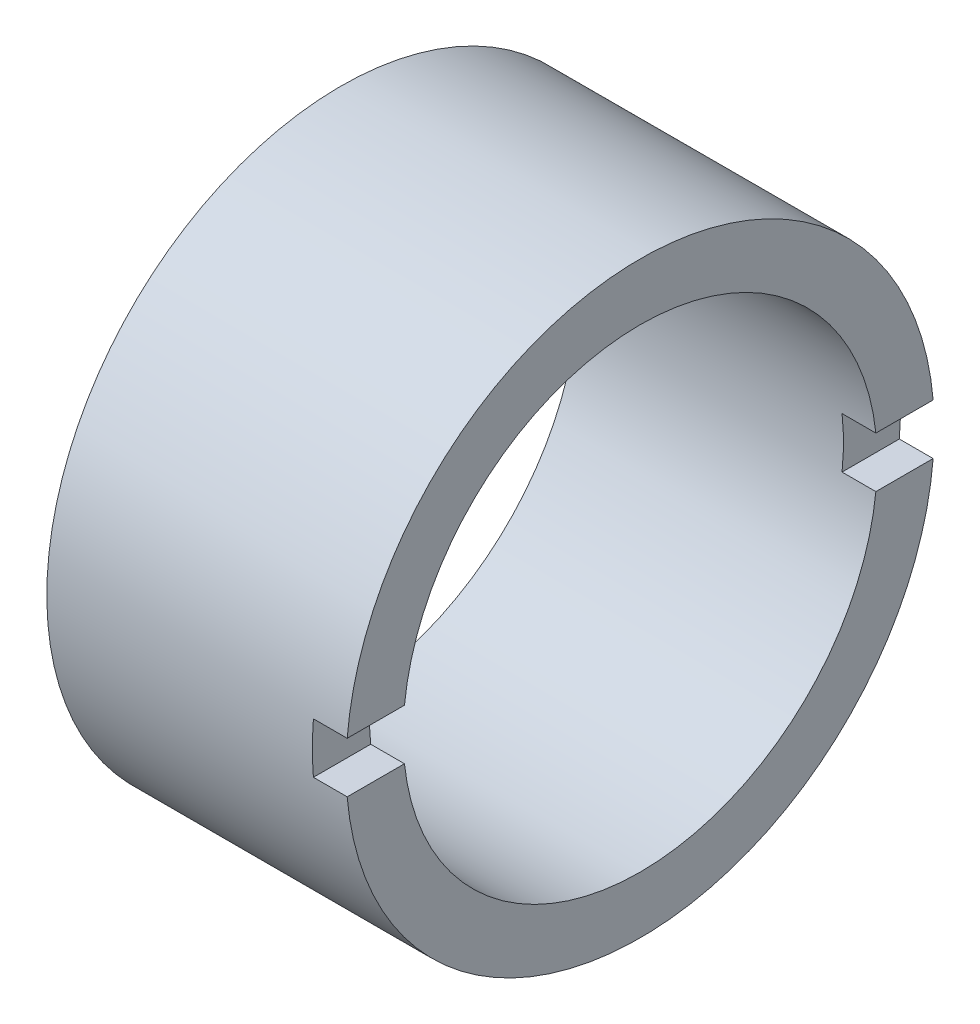
ISO-10303-21;
HEADER;
FILE_DESCRIPTION(('STEP AP214'),'2;1');
FILE_NAME('part.step','',(''),(''),'','','');
FILE_SCHEMA(('AUTOMOTIVE_DESIGN { 1 0 10303 214 1 1 1 1 }'));
ENDSEC;
DATA;
#1=APPLICATION_CONTEXT('core data for automotive mechanical design processes');
#2=APPLICATION_PROTOCOL_DEFINITION('international standard','automotive_design',2000,#1);
#3=PRODUCT_CONTEXT('',#1,'mechanical');
#4=PRODUCT('Part','Part','',(#3));
#5=PRODUCT_RELATED_PRODUCT_CATEGORY('part','',(#4));
#6=PRODUCT_DEFINITION_FORMATION('','',#4);
#7=PRODUCT_DEFINITION_CONTEXT('part definition',#1,'design');
#8=PRODUCT_DEFINITION('design','',#6,#7);
#9=PRODUCT_DEFINITION_SHAPE('','',#8);
#10=(LENGTH_UNIT() NAMED_UNIT(*) SI_UNIT(.MILLI.,.METRE.));
#11=(NAMED_UNIT(*) PLANE_ANGLE_UNIT() SI_UNIT($,.RADIAN.));
#12=(NAMED_UNIT(*) SI_UNIT($,.STERADIAN.) SOLID_ANGLE_UNIT());
#13=UNCERTAINTY_MEASURE_WITH_UNIT(LENGTH_MEASURE(1.E-05),#10,'distance_accuracy_value','');
#14=(GEOMETRIC_REPRESENTATION_CONTEXT(3) GLOBAL_UNCERTAINTY_ASSIGNED_CONTEXT((#13)) GLOBAL_UNIT_ASSIGNED_CONTEXT((#10,
#11,#12)) REPRESENTATION_CONTEXT('',''));
#15=CARTESIAN_POINT('',(0.,0.,0.));
#16=DIRECTION('',(0.,0.,1.));
#17=DIRECTION('',(1.,0.,0.));
#18=AXIS2_PLACEMENT_3D('',#15,#16,#17);
#19=CARTESIAN_POINT('',(27.0002,0.,0.));
#20=DIRECTION('',(1.,0.,0.));
#21=DIRECTION('',(0.,0.,-1.));
#22=AXIS2_PLACEMENT_3D('',#19,#20,#21);
#23=PLANE('',#22);
#24=DIRECTION('',(0.,0.,1.));
#25=VECTOR('',#24,1.);
#26=CARTESIAN_POINT('',(27.0002,2.28600000000001,-26.5303));
#27=LINE('',#26,#25);
#28=CARTESIAN_POINT('',(27.0002,2.28600000000001,-26.4316291985568));
#29=VERTEX_POINT('',#28);
#30=CARTESIAN_POINT('',(27.0002,2.28600000000001,-21.2642756340299));
#31=VERTEX_POINT('',#30);
#32=EDGE_CURVE('E157',#29,#31,#27,.T.);
#33=ORIENTED_EDGE('',*,*,#32,.F.);
#34=CARTESIAN_POINT('',(27.0002,0.,0.));
#35=DIRECTION('',(1.,0.,0.));
#36=DIRECTION('',(0.,0.,-1.));
#37=AXIS2_PLACEMENT_3D('',#34,#35,#36);
#38=CIRCLE('',#37,26.5303);
#39=CARTESIAN_POINT('',(27.0002,2.28600000000001,26.4316291985568));
#40=VERTEX_POINT('',#39);
#41=EDGE_CURVE('E124',#29,#40,#38,.T.);
#42=ORIENTED_EDGE('',*,*,#41,.T.);
#43=CARTESIAN_POINT('',(27.0002,2.28600000000001,21.2642756340299));
#44=VERTEX_POINT('',#43);
#45=EDGE_CURVE('E111',#44,#40,#27,.T.);
#46=ORIENTED_EDGE('',*,*,#45,.F.);
#47=CARTESIAN_POINT('',(27.0002,0.,0.));
#48=DIRECTION('',(1.,0.,0.));
#49=DIRECTION('',(0.,0.,-1.));
#50=AXIS2_PLACEMENT_3D('',#47,#48,#49);
#51=CIRCLE('',#50,21.3868);
#52=EDGE_CURVE('E129',#31,#44,#51,.T.);
#53=ORIENTED_EDGE('',*,*,#52,.F.);
#54=EDGE_LOOP('',(#33,#42,#46,#53));
#55=FACE_BOUND('',#54,.T.);
#56=ADVANCED_FACE('F38',(#55),#23,.T.);
#57=DIRECTION('',(0.,0.,1.));
#58=VECTOR('',#57,1.);
#59=CARTESIAN_POINT('',(27.0002,-2.28599999999999,-26.5303));
#60=LINE('',#59,#58);
#61=CARTESIAN_POINT('',(27.0002,-2.28599999999999,21.26427563403));
#62=VERTEX_POINT('',#61);
#63=CARTESIAN_POINT('',(27.0002,-2.28599999999999,26.4316291985568));
#64=VERTEX_POINT('',#63);
#65=EDGE_CURVE('E61',#62,#64,#60,.T.);
#66=ORIENTED_EDGE('',*,*,#65,.T.);
#67=CARTESIAN_POINT('',(27.0002,-2.28599999999999,-26.4316291985568));
#68=VERTEX_POINT('',#67);
#69=EDGE_CURVE('E118',#64,#68,#38,.T.);
#70=ORIENTED_EDGE('',*,*,#69,.T.);
#71=CARTESIAN_POINT('',(27.0002,-2.28599999999999,-21.26427563403));
#72=VERTEX_POINT('',#71);
#73=EDGE_CURVE('E101',#68,#72,#60,.T.);
#74=ORIENTED_EDGE('',*,*,#73,.T.);
#75=EDGE_CURVE('E167',#62,#72,#51,.T.);
#76=ORIENTED_EDGE('',*,*,#75,.F.);
#77=EDGE_LOOP('',(#66,#70,#74,#76));
#78=FACE_BOUND('',#77,.T.);
#79=ADVANCED_FACE('F123',(#78),#23,.T.);
#80=CARTESIAN_POINT('',(0.,0.,0.));
#81=DIRECTION('',(1.,0.,0.));
#82=DIRECTION('',(0.,0.,-1.));
#83=AXIS2_PLACEMENT_3D('',#80,#81,#82);
#84=PLANE('',#83);
#85=CARTESIAN_POINT('',(0.,0.,0.));
#86=DIRECTION('',(1.,0.,0.));
#87=DIRECTION('',(0.,0.,-1.));
#88=AXIS2_PLACEMENT_3D('',#85,#86,#87);
#89=CIRCLE('',#88,26.5303);
#90=CARTESIAN_POINT('',(0.,0.,-26.5303));
#91=VERTEX_POINT('',#90);
#92=EDGE_CURVE('E125',#91,#91,#89,.T.);
#93=ORIENTED_EDGE('',*,*,#92,.F.);
#94=EDGE_LOOP('',(#93));
#95=FACE_BOUND('',#94,.T.);
#96=CARTESIAN_POINT('',(0.,0.,0.));
#97=DIRECTION('',(1.,0.,0.));
#98=DIRECTION('',(0.,0.,-1.));
#99=AXIS2_PLACEMENT_3D('',#96,#97,#98);
#100=CIRCLE('',#99,21.3868);
#101=CARTESIAN_POINT('',(0.,0.,-21.3868));
#102=VERTEX_POINT('',#101);
#103=EDGE_CURVE('E132',#102,#102,#100,.T.);
#104=ORIENTED_EDGE('',*,*,#103,.T.);
#105=EDGE_LOOP('',(#104));
#106=FACE_BOUND('',#105,.T.);
#107=ADVANCED_FACE('F195',(#95,#106),#84,.F.);
#108=CARTESIAN_POINT('',(27.0002,0.,0.));
#109=DIRECTION('',(-1.,0.,0.));
#110=DIRECTION('',(0.,0.,1.));
#111=AXIS2_PLACEMENT_3D('',#108,#109,#110);
#112=CYLINDRICAL_SURFACE('',#111,26.5303);
#113=DIRECTION('',(-1.,0.,0.));
#114=VECTOR('',#113,1.);
#115=CARTESIAN_POINT('',(27.0002,2.28600000000001,-26.4316291985568));
#116=LINE('',#115,#114);
#117=CARTESIAN_POINT('',(23.9522,2.28600000000001,-26.4316291985568));
#118=VERTEX_POINT('',#117);
#119=EDGE_CURVE('E171',#29,#118,#116,.T.);
#120=ORIENTED_EDGE('',*,*,#119,.T.);
#121=CARTESIAN_POINT('',(23.9522,0.,0.));
#122=DIRECTION('',(-1.,0.,0.));
#123=DIRECTION('',(0.,0.,1.));
#124=AXIS2_PLACEMENT_3D('',#121,#122,#123);
#125=CIRCLE('',#124,26.5303);
#126=CARTESIAN_POINT('',(23.9522,-2.28599999999999,-26.4316291985568));
#127=VERTEX_POINT('',#126);
#128=EDGE_CURVE('E119',#118,#127,#125,.T.);
#129=ORIENTED_EDGE('',*,*,#128,.T.);
#130=DIRECTION('',(-1.,0.,0.));
#131=VECTOR('',#130,1.);
#132=CARTESIAN_POINT('',(27.0002,-2.28599999999999,-26.4316291985568));
#133=LINE('',#132,#131);
#134=EDGE_CURVE('E104',#127,#68,#133,.F.);
#135=ORIENTED_EDGE('',*,*,#134,.T.);
#136=ORIENTED_EDGE('',*,*,#69,.F.);
#137=DIRECTION('',(-1.,0.,0.));
#138=VECTOR('',#137,1.);
#139=CARTESIAN_POINT('',(27.0002,-2.28599999999999,26.4316291985568));
#140=LINE('',#139,#138);
#141=CARTESIAN_POINT('',(23.9522,-2.28599999999999,26.4316291985568));
#142=VERTEX_POINT('',#141);
#143=EDGE_CURVE('E120',#64,#142,#140,.T.);
#144=ORIENTED_EDGE('',*,*,#143,.T.);
#145=CARTESIAN_POINT('',(23.9522,2.28600000000001,26.4316291985568));
#146=VERTEX_POINT('',#145);
#147=EDGE_CURVE('E169',#142,#146,#125,.T.);
#148=ORIENTED_EDGE('',*,*,#147,.T.);
#149=DIRECTION('',(-1.,0.,0.));
#150=VECTOR('',#149,1.);
#151=CARTESIAN_POINT('',(27.0002,2.28600000000001,26.4316291985568));
#152=LINE('',#151,#150);
#153=EDGE_CURVE('E156',#146,#40,#152,.F.);
#154=ORIENTED_EDGE('',*,*,#153,.T.);
#155=ORIENTED_EDGE('',*,*,#41,.F.);
#156=EDGE_LOOP('',(#120,#129,#135,#136,#144,#148,#154,#155));
#157=FACE_BOUND('',#156,.T.);
#158=ORIENTED_EDGE('',*,*,#92,.T.);
#159=EDGE_LOOP('',(#158));
#160=FACE_BOUND('',#159,.T.);
#161=ADVANCED_FACE('F40',(#157,#160),#112,.T.);
#162=CARTESIAN_POINT('',(27.0002,0.,0.));
#163=DIRECTION('',(-1.,0.,0.));
#164=DIRECTION('',(0.,0.,1.));
#165=AXIS2_PLACEMENT_3D('',#162,#163,#164);
#166=CYLINDRICAL_SURFACE('',#165,21.3868);
#167=DIRECTION('',(-1.,0.,0.));
#168=VECTOR('',#167,1.);
#169=CARTESIAN_POINT('',(27.0002,2.28600000000001,21.2642756340299));
#170=LINE('',#169,#168);
#171=CARTESIAN_POINT('',(23.9522,2.28600000000001,21.2642756340299));
#172=VERTEX_POINT('',#171);
#173=EDGE_CURVE('E11',#172,#44,#170,.F.);
#174=ORIENTED_EDGE('',*,*,#173,.F.);
#175=CARTESIAN_POINT('',(23.9522,0.,0.));
#176=DIRECTION('',(-1.,0.,0.));
#177=DIRECTION('',(0.,0.,1.));
#178=AXIS2_PLACEMENT_3D('',#175,#176,#177);
#179=CIRCLE('',#178,21.3868);
#180=CARTESIAN_POINT('',(23.9522,-2.28599999999999,21.26427563403));
#181=VERTEX_POINT('',#180);
#182=EDGE_CURVE('E46',#181,#172,#179,.T.);
#183=ORIENTED_EDGE('',*,*,#182,.F.);
#184=DIRECTION('',(-1.,0.,0.));
#185=VECTOR('',#184,1.);
#186=CARTESIAN_POINT('',(27.0002,-2.28599999999999,21.26427563403));
#187=LINE('',#186,#185);
#188=EDGE_CURVE('E139',#62,#181,#187,.T.);
#189=ORIENTED_EDGE('',*,*,#188,.F.);
#190=ORIENTED_EDGE('',*,*,#75,.T.);
#191=DIRECTION('',(-1.,0.,0.));
#192=VECTOR('',#191,1.);
#193=CARTESIAN_POINT('',(27.0002,-2.28599999999999,-21.26427563403));
#194=LINE('',#193,#192);
#195=CARTESIAN_POINT('',(23.9522,-2.28599999999999,-21.26427563403));
#196=VERTEX_POINT('',#195);
#197=EDGE_CURVE('E106',#196,#72,#194,.F.);
#198=ORIENTED_EDGE('',*,*,#197,.F.);
#199=CARTESIAN_POINT('',(23.9522,2.28600000000001,-21.2642756340299));
#200=VERTEX_POINT('',#199);
#201=EDGE_CURVE('E136',#200,#196,#179,.T.);
#202=ORIENTED_EDGE('',*,*,#201,.F.);
#203=DIRECTION('',(-1.,0.,0.));
#204=VECTOR('',#203,1.);
#205=CARTESIAN_POINT('',(27.0002,2.28600000000001,-21.2642756340299));
#206=LINE('',#205,#204);
#207=EDGE_CURVE('E138',#31,#200,#206,.T.);
#208=ORIENTED_EDGE('',*,*,#207,.F.);
#209=ORIENTED_EDGE('',*,*,#52,.T.);
#210=EDGE_LOOP('',(#174,#183,#189,#190,#198,#202,#208,#209));
#211=FACE_BOUND('',#210,.T.);
#212=ORIENTED_EDGE('',*,*,#103,.F.);
#213=EDGE_LOOP('',(#212));
#214=FACE_BOUND('',#213,.T.);
#215=ADVANCED_FACE('F160',(#211,#214),#166,.F.);
#216=CARTESIAN_POINT('',(27.0002,-2.28599999999999,-26.5303));
#217=DIRECTION('',(0.,-1.,0.));
#218=DIRECTION('',(0.,0.,-1.));
#219=AXIS2_PLACEMENT_3D('',#216,#217,#218);
#220=PLANE('',#219);
#221=DIRECTION('',(0.,0.,1.));
#222=VECTOR('',#221,1.);
#223=CARTESIAN_POINT('',(23.9522,-2.28599999999999,-26.5303));
#224=LINE('',#223,#222);
#225=EDGE_CURVE('E53',#127,#196,#224,.T.);
#226=ORIENTED_EDGE('',*,*,#225,.T.);
#227=ORIENTED_EDGE('',*,*,#197,.T.);
#228=ORIENTED_EDGE('',*,*,#73,.F.);
#229=ORIENTED_EDGE('',*,*,#134,.F.);
#230=EDGE_LOOP('',(#226,#227,#228,#229));
#231=FACE_BOUND('',#230,.T.);
#232=ADVANCED_FACE('F103',(#231),#220,.F.);
#233=CARTESIAN_POINT('',(27.0002,2.28600000000001,-26.5303));
#234=DIRECTION('',(0.,1.,0.));
#235=DIRECTION('',(-1.,0.,0.));
#236=AXIS2_PLACEMENT_3D('',#233,#234,#235);
#237=PLANE('',#236);
#238=ORIENTED_EDGE('',*,*,#32,.T.);
#239=ORIENTED_EDGE('',*,*,#207,.T.);
#240=DIRECTION('',(0.,0.,1.));
#241=VECTOR('',#240,1.);
#242=CARTESIAN_POINT('',(23.9522,2.28600000000001,-26.5303));
#243=LINE('',#242,#241);
#244=EDGE_CURVE('E121',#118,#200,#243,.T.);
#245=ORIENTED_EDGE('',*,*,#244,.F.);
#246=ORIENTED_EDGE('',*,*,#119,.F.);
#247=EDGE_LOOP('',(#238,#239,#245,#246));
#248=FACE_BOUND('',#247,.T.);
#249=ADVANCED_FACE('F177',(#248),#237,.F.);
#250=CARTESIAN_POINT('',(23.9522,-2.28599999999999,-26.5303));
#251=DIRECTION('',(-1.,0.,0.));
#252=DIRECTION('',(0.,0.,1.));
#253=AXIS2_PLACEMENT_3D('',#250,#251,#252);
#254=PLANE('',#253);
#255=ORIENTED_EDGE('',*,*,#244,.T.);
#256=ORIENTED_EDGE('',*,*,#201,.T.);
#257=ORIENTED_EDGE('',*,*,#225,.F.);
#258=ORIENTED_EDGE('',*,*,#128,.F.);
#259=EDGE_LOOP('',(#255,#256,#257,#258));
#260=FACE_BOUND('',#259,.T.);
#261=ADVANCED_FACE('F219',(#260),#254,.F.);
#262=ORIENTED_EDGE('',*,*,#147,.F.);
#263=EDGE_CURVE('E148',#181,#142,#224,.T.);
#264=ORIENTED_EDGE('',*,*,#263,.F.);
#265=ORIENTED_EDGE('',*,*,#182,.T.);
#266=EDGE_CURVE('E147',#172,#146,#243,.T.);
#267=ORIENTED_EDGE('',*,*,#266,.T.);
#268=EDGE_LOOP('',(#262,#264,#265,#267));
#269=FACE_BOUND('',#268,.T.);
#270=ADVANCED_FACE('F146',(#269),#254,.F.);
#271=ORIENTED_EDGE('',*,*,#266,.F.);
#272=ORIENTED_EDGE('',*,*,#173,.T.);
#273=ORIENTED_EDGE('',*,*,#45,.T.);
#274=ORIENTED_EDGE('',*,*,#153,.F.);
#275=EDGE_LOOP('',(#271,#272,#273,#274));
#276=FACE_BOUND('',#275,.T.);
#277=ADVANCED_FACE('F153',(#276),#237,.F.);
#278=ORIENTED_EDGE('',*,*,#65,.F.);
#279=ORIENTED_EDGE('',*,*,#188,.T.);
#280=ORIENTED_EDGE('',*,*,#263,.T.);
#281=ORIENTED_EDGE('',*,*,#143,.F.);
#282=EDGE_LOOP('',(#278,#279,#280,#281));
#283=FACE_BOUND('',#282,.T.);
#284=ADVANCED_FACE('F181',(#283),#220,.F.);
#285=CLOSED_SHELL('',(#56,#79,#107,#161,#215,#232,#249,#261,#270,#277,#284));
#286=MANIFOLD_SOLID_BREP('B2',#285);
#287=ADVANCED_BREP_SHAPE_REPRESENTATION('',(#18,#286),#14);
#288=SHAPE_DEFINITION_REPRESENTATION(#9,#287);
ENDSEC;
END-ISO-10303-21;
